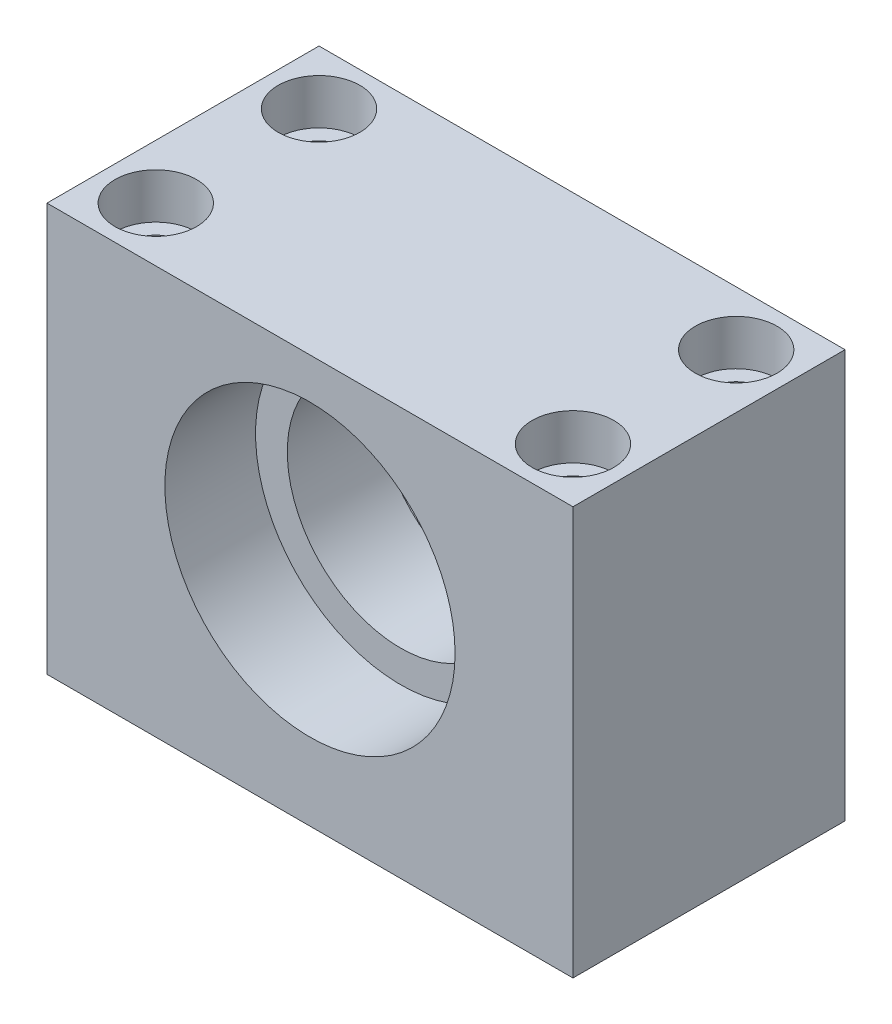
ISO-10303-21;
HEADER;
FILE_DESCRIPTION(('STEP AP214'),'2;1');
FILE_NAME('part.step','',(''),(''),'','','');
FILE_SCHEMA(('AUTOMOTIVE_DESIGN { 1 0 10303 214 1 1 1 1 }'));
ENDSEC;
DATA;
#1=APPLICATION_CONTEXT('core data for automotive mechanical design processes');
#2=APPLICATION_PROTOCOL_DEFINITION('international standard','automotive_design',2000,#1);
#3=PRODUCT_CONTEXT('',#1,'mechanical');
#4=PRODUCT('Part','Part','',(#3));
#5=PRODUCT_RELATED_PRODUCT_CATEGORY('part','',(#4));
#6=PRODUCT_DEFINITION_FORMATION('','',#4);
#7=PRODUCT_DEFINITION_CONTEXT('part definition',#1,'design');
#8=PRODUCT_DEFINITION('design','',#6,#7);
#9=PRODUCT_DEFINITION_SHAPE('','',#8);
#10=(LENGTH_UNIT() NAMED_UNIT(*) SI_UNIT(.MILLI.,.METRE.));
#11=(NAMED_UNIT(*) PLANE_ANGLE_UNIT() SI_UNIT($,.RADIAN.));
#12=(NAMED_UNIT(*) SI_UNIT($,.STERADIAN.) SOLID_ANGLE_UNIT());
#13=UNCERTAINTY_MEASURE_WITH_UNIT(LENGTH_MEASURE(1.E-05),#10,'distance_accuracy_value','');
#14=(GEOMETRIC_REPRESENTATION_CONTEXT(3) GLOBAL_UNCERTAINTY_ASSIGNED_CONTEXT((#13)) GLOBAL_UNIT_ASSIGNED_CONTEXT((#10,
#11,#12)) REPRESENTATION_CONTEXT('',''));
#15=CARTESIAN_POINT('',(0.,0.,0.));
#16=DIRECTION('',(0.,0.,1.));
#17=DIRECTION('',(1.,0.,0.));
#18=AXIS2_PLACEMENT_3D('',#15,#16,#17);
#19=CARTESIAN_POINT('',(0.,24.5,-15.));
#20=DIRECTION('',(0.,0.,1.));
#21=DIRECTION('',(1.,0.,0.));
#22=AXIS2_PLACEMENT_3D('',#19,#20,#21);
#23=CYLINDRICAL_SURFACE('',#22,12.5);
#24=CARTESIAN_POINT('',(0.,24.5,5.));
#25=DIRECTION('',(0.,0.,1.));
#26=DIRECTION('',(1.,0.,0.));
#27=AXIS2_PLACEMENT_3D('',#24,#25,#26);
#28=CIRCLE('',#27,12.5);
#29=CARTESIAN_POINT('',(12.5,24.5,5.));
#30=VERTEX_POINT('',#29);
#31=EDGE_CURVE('E103',#30,#30,#28,.F.);
#32=ORIENTED_EDGE('',*,*,#31,.F.);
#33=EDGE_LOOP('',(#32));
#34=FACE_BOUND('',#33,.T.);
#35=CARTESIAN_POINT('',(0.,24.5,-5.));
#36=DIRECTION('',(0.,0.,-1.));
#37=DIRECTION('',(-1.,0.,0.));
#38=AXIS2_PLACEMENT_3D('',#35,#36,#37);
#39=CIRCLE('',#38,12.5);
#40=CARTESIAN_POINT('',(-12.5,24.5,-5.));
#41=VERTEX_POINT('',#40);
#42=EDGE_CURVE('E36',#41,#41,#39,.F.);
#43=ORIENTED_EDGE('',*,*,#42,.F.);
#44=EDGE_LOOP('',(#43));
#45=FACE_BOUND('',#44,.T.);
#46=ADVANCED_FACE('F32',(#34,#45),#23,.F.);
#47=CARTESIAN_POINT('',(-29.,45.,-15.));
#48=DIRECTION('',(0.,0.,1.));
#49=DIRECTION('',(1.,0.,0.));
#50=AXIS2_PLACEMENT_3D('',#47,#48,#49);
#51=PLANE('',#50);
#52=DIRECTION('',(-1.,0.,0.));
#53=VECTOR('',#52,1.);
#54=CARTESIAN_POINT('',(-29.,0.,-15.));
#55=LINE('',#54,#53);
#56=CARTESIAN_POINT('',(29.,0.,-15.));
#57=VERTEX_POINT('',#56);
#58=CARTESIAN_POINT('',(-29.,0.,-15.));
#59=VERTEX_POINT('',#58);
#60=EDGE_CURVE('E91',#57,#59,#55,.T.);
#61=ORIENTED_EDGE('',*,*,#60,.T.);
#62=DIRECTION('',(0.,-1.,0.));
#63=VECTOR('',#62,1.);
#64=CARTESIAN_POINT('',(-29.,45.,-15.));
#65=LINE('',#64,#63);
#66=CARTESIAN_POINT('',(-29.,45.,-15.));
#67=VERTEX_POINT('',#66);
#68=EDGE_CURVE('E42',#67,#59,#65,.T.);
#69=ORIENTED_EDGE('',*,*,#68,.F.);
#70=DIRECTION('',(-1.,0.,0.));
#71=VECTOR('',#70,1.);
#72=CARTESIAN_POINT('',(-29.,45.,-15.));
#73=LINE('',#72,#71);
#74=CARTESIAN_POINT('',(29.,45.,-15.));
#75=VERTEX_POINT('',#74);
#76=EDGE_CURVE('E81',#75,#67,#73,.T.);
#77=ORIENTED_EDGE('',*,*,#76,.F.);
#78=DIRECTION('',(0.,-1.,0.));
#79=VECTOR('',#78,1.);
#80=CARTESIAN_POINT('',(29.,45.,-15.));
#81=LINE('',#80,#79);
#82=EDGE_CURVE('E11',#75,#57,#81,.T.);
#83=ORIENTED_EDGE('',*,*,#82,.T.);
#84=EDGE_LOOP('',(#61,#69,#77,#83));
#85=FACE_BOUND('',#84,.T.);
#86=CARTESIAN_POINT('',(0.,24.5,-15.));
#87=DIRECTION('',(0.,0.,1.));
#88=DIRECTION('',(1.,0.,0.));
#89=AXIS2_PLACEMENT_3D('',#86,#87,#88);
#90=CIRCLE('',#89,16.);
#91=CARTESIAN_POINT('',(16.,24.5,-15.));
#92=VERTEX_POINT('',#91);
#93=EDGE_CURVE('E120',#92,#92,#90,.T.);
#94=ORIENTED_EDGE('',*,*,#93,.T.);
#95=EDGE_LOOP('',(#94));
#96=FACE_BOUND('',#95,.T.);
#97=ADVANCED_FACE('F89',(#85,#96),#51,.F.);
#98=CARTESIAN_POINT('',(29.,45.,15.));
#99=DIRECTION('',(-1.,0.,0.));
#100=DIRECTION('',(0.,0.,1.));
#101=AXIS2_PLACEMENT_3D('',#98,#99,#100);
#102=PLANE('',#101);
#103=DIRECTION('',(0.,0.,-1.));
#104=VECTOR('',#103,1.);
#105=CARTESIAN_POINT('',(29.,0.,15.));
#106=LINE('',#105,#104);
#107=CARTESIAN_POINT('',(29.,0.,15.));
#108=VERTEX_POINT('',#107);
#109=EDGE_CURVE('E100',#108,#57,#106,.T.);
#110=ORIENTED_EDGE('',*,*,#109,.T.);
#111=ORIENTED_EDGE('',*,*,#82,.F.);
#112=DIRECTION('',(0.,0.,-1.));
#113=VECTOR('',#112,1.);
#114=CARTESIAN_POINT('',(29.,45.,15.));
#115=LINE('',#114,#113);
#116=CARTESIAN_POINT('',(29.,45.,15.));
#117=VERTEX_POINT('',#116);
#118=EDGE_CURVE('E86',#117,#75,#115,.T.);
#119=ORIENTED_EDGE('',*,*,#118,.F.);
#120=DIRECTION('',(0.,-1.,0.));
#121=VECTOR('',#120,1.);
#122=CARTESIAN_POINT('',(29.,45.,15.));
#123=LINE('',#122,#121);
#124=EDGE_CURVE('E96',#117,#108,#123,.T.);
#125=ORIENTED_EDGE('',*,*,#124,.T.);
#126=EDGE_LOOP('',(#110,#111,#119,#125));
#127=FACE_BOUND('',#126,.T.);
#128=ADVANCED_FACE('F34',(#127),#102,.F.);
#129=CARTESIAN_POINT('',(-29.,45.,15.));
#130=DIRECTION('',(1.,0.,0.));
#131=DIRECTION('',(0.,0.,-1.));
#132=AXIS2_PLACEMENT_3D('',#129,#130,#131);
#133=PLANE('',#132);
#134=DIRECTION('',(0.,0.,1.));
#135=VECTOR('',#134,1.);
#136=CARTESIAN_POINT('',(-29.,0.,15.));
#137=LINE('',#136,#135);
#138=CARTESIAN_POINT('',(-29.,0.,15.));
#139=VERTEX_POINT('',#138);
#140=EDGE_CURVE('E68',#59,#139,#137,.T.);
#141=ORIENTED_EDGE('',*,*,#140,.T.);
#142=DIRECTION('',(0.,-1.,0.));
#143=VECTOR('',#142,1.);
#144=CARTESIAN_POINT('',(-29.,45.,15.));
#145=LINE('',#144,#143);
#146=CARTESIAN_POINT('',(-29.,45.,15.));
#147=VERTEX_POINT('',#146);
#148=EDGE_CURVE('E92',#147,#139,#145,.T.);
#149=ORIENTED_EDGE('',*,*,#148,.F.);
#150=DIRECTION('',(0.,0.,1.));
#151=VECTOR('',#150,1.);
#152=CARTESIAN_POINT('',(-29.,45.,15.));
#153=LINE('',#152,#151);
#154=EDGE_CURVE('E84',#67,#147,#153,.T.);
#155=ORIENTED_EDGE('',*,*,#154,.F.);
#156=ORIENTED_EDGE('',*,*,#68,.T.);
#157=EDGE_LOOP('',(#141,#149,#155,#156));
#158=FACE_BOUND('',#157,.T.);
#159=ADVANCED_FACE('F94',(#158),#133,.F.);
#160=CARTESIAN_POINT('',(-29.,45.,15.));
#161=DIRECTION('',(0.,0.,-1.));
#162=DIRECTION('',(-1.,0.,0.));
#163=AXIS2_PLACEMENT_3D('',#160,#161,#162);
#164=PLANE('',#163);
#165=CARTESIAN_POINT('',(0.,24.5,15.));
#166=DIRECTION('',(0.,0.,1.));
#167=DIRECTION('',(1.,0.,0.));
#168=AXIS2_PLACEMENT_3D('',#165,#166,#167);
#169=CIRCLE('',#168,16.);
#170=CARTESIAN_POINT('',(16.,24.5,15.));
#171=VERTEX_POINT('',#170);
#172=EDGE_CURVE('E113',#171,#171,#169,.T.);
#173=ORIENTED_EDGE('',*,*,#172,.F.);
#174=EDGE_LOOP('',(#173));
#175=FACE_BOUND('',#174,.T.);
#176=DIRECTION('',(1.,0.,0.));
#177=VECTOR('',#176,1.);
#178=CARTESIAN_POINT('',(-29.,0.,15.));
#179=LINE('',#178,#177);
#180=EDGE_CURVE('E74',#139,#108,#179,.T.);
#181=ORIENTED_EDGE('',*,*,#180,.T.);
#182=ORIENTED_EDGE('',*,*,#124,.F.);
#183=DIRECTION('',(1.,0.,0.));
#184=VECTOR('',#183,1.);
#185=CARTESIAN_POINT('',(-29.,45.,15.));
#186=LINE('',#185,#184);
#187=EDGE_CURVE('E51',#147,#117,#186,.T.);
#188=ORIENTED_EDGE('',*,*,#187,.F.);
#189=ORIENTED_EDGE('',*,*,#148,.T.);
#190=EDGE_LOOP('',(#181,#182,#188,#189));
#191=FACE_BOUND('',#190,.T.);
#192=ADVANCED_FACE('F180',(#175,#191),#164,.F.);
#193=CARTESIAN_POINT('',(0.,45.,0.));
#194=DIRECTION('',(0.,-1.,0.));
#195=DIRECTION('',(0.,0.,-1.));
#196=AXIS2_PLACEMENT_3D('',#193,#194,#195);
#197=PLANE('',#196);
#198=CARTESIAN_POINT('',(-23.,45.,9.));
#199=DIRECTION('',(0.,1.,0.));
#200=DIRECTION('',(0.,0.,1.));
#201=AXIS2_PLACEMENT_3D('',#198,#199,#200);
#202=CIRCLE('',#201,4.5);
#203=CARTESIAN_POINT('',(-23.,45.,13.5));
#204=VERTEX_POINT('',#203);
#205=EDGE_CURVE('E171',#204,#204,#202,.T.);
#206=ORIENTED_EDGE('',*,*,#205,.F.);
#207=EDGE_LOOP('',(#206));
#208=FACE_BOUND('',#207,.T.);
#209=CARTESIAN_POINT('',(-23.,45.,-9.));
#210=DIRECTION('',(0.,1.,0.));
#211=DIRECTION('',(0.,0.,1.));
#212=AXIS2_PLACEMENT_3D('',#209,#210,#211);
#213=CIRCLE('',#212,4.5);
#214=CARTESIAN_POINT('',(-23.,45.,-4.5));
#215=VERTEX_POINT('',#214);
#216=EDGE_CURVE('E159',#215,#215,#213,.T.);
#217=ORIENTED_EDGE('',*,*,#216,.F.);
#218=EDGE_LOOP('',(#217));
#219=FACE_BOUND('',#218,.T.);
#220=CARTESIAN_POINT('',(23.,45.,9.));
#221=DIRECTION('',(0.,1.,0.));
#222=DIRECTION('',(0.,0.,1.));
#223=AXIS2_PLACEMENT_3D('',#220,#221,#222);
#224=CIRCLE('',#223,4.5);
#225=CARTESIAN_POINT('',(23.,45.,13.5));
#226=VERTEX_POINT('',#225);
#227=EDGE_CURVE('E147',#226,#226,#224,.T.);
#228=ORIENTED_EDGE('',*,*,#227,.F.);
#229=EDGE_LOOP('',(#228));
#230=FACE_BOUND('',#229,.T.);
#231=CARTESIAN_POINT('',(23.,45.,-9.));
#232=DIRECTION('',(0.,1.,0.));
#233=DIRECTION('',(0.,0.,1.));
#234=AXIS2_PLACEMENT_3D('',#231,#232,#233);
#235=CIRCLE('',#234,4.5);
#236=CARTESIAN_POINT('',(23.,45.,-4.5));
#237=VERTEX_POINT('',#236);
#238=EDGE_CURVE('E135',#237,#237,#235,.T.);
#239=ORIENTED_EDGE('',*,*,#238,.F.);
#240=EDGE_LOOP('',(#239));
#241=FACE_BOUND('',#240,.T.);
#242=ORIENTED_EDGE('',*,*,#118,.T.);
#243=ORIENTED_EDGE('',*,*,#76,.T.);
#244=ORIENTED_EDGE('',*,*,#154,.T.);
#245=ORIENTED_EDGE('',*,*,#187,.T.);
#246=EDGE_LOOP('',(#242,#243,#244,#245));
#247=FACE_BOUND('',#246,.T.);
#248=ADVANCED_FACE('F82',(#208,#219,#230,#241,#247),#197,.F.);
#249=CARTESIAN_POINT('',(0.,0.,0.));
#250=DIRECTION('',(0.,-1.,0.));
#251=DIRECTION('',(0.,0.,-1.));
#252=AXIS2_PLACEMENT_3D('',#249,#250,#251);
#253=PLANE('',#252);
#254=CARTESIAN_POINT('',(-23.,0.,9.));
#255=DIRECTION('',(0.,1.,0.));
#256=DIRECTION('',(0.,0.,1.));
#257=AXIS2_PLACEMENT_3D('',#254,#255,#256);
#258=CIRCLE('',#257,2.74999999999999);
#259=CARTESIAN_POINT('',(-23.,0.,11.75));
#260=VERTEX_POINT('',#259);
#261=EDGE_CURVE('E162',#260,#260,#258,.T.);
#262=ORIENTED_EDGE('',*,*,#261,.T.);
#263=EDGE_LOOP('',(#262));
#264=FACE_BOUND('',#263,.T.);
#265=CARTESIAN_POINT('',(-23.,0.,-9.));
#266=DIRECTION('',(0.,1.,0.));
#267=DIRECTION('',(0.,0.,1.));
#268=AXIS2_PLACEMENT_3D('',#265,#266,#267);
#269=CIRCLE('',#268,2.74999999999999);
#270=CARTESIAN_POINT('',(-23.,0.,-6.25000000000001));
#271=VERTEX_POINT('',#270);
#272=EDGE_CURVE('E150',#271,#271,#269,.T.);
#273=ORIENTED_EDGE('',*,*,#272,.T.);
#274=EDGE_LOOP('',(#273));
#275=FACE_BOUND('',#274,.T.);
#276=CARTESIAN_POINT('',(23.,0.,9.));
#277=DIRECTION('',(0.,1.,0.));
#278=DIRECTION('',(0.,0.,1.));
#279=AXIS2_PLACEMENT_3D('',#276,#277,#278);
#280=CIRCLE('',#279,2.74999999999999);
#281=CARTESIAN_POINT('',(23.,0.,11.75));
#282=VERTEX_POINT('',#281);
#283=EDGE_CURVE('E138',#282,#282,#280,.T.);
#284=ORIENTED_EDGE('',*,*,#283,.T.);
#285=EDGE_LOOP('',(#284));
#286=FACE_BOUND('',#285,.T.);
#287=CARTESIAN_POINT('',(23.,0.,-9.));
#288=DIRECTION('',(0.,1.,0.));
#289=DIRECTION('',(0.,0.,1.));
#290=AXIS2_PLACEMENT_3D('',#287,#288,#289);
#291=CIRCLE('',#290,2.74999999999999);
#292=CARTESIAN_POINT('',(23.,0.,-6.25000000000001));
#293=VERTEX_POINT('',#292);
#294=EDGE_CURVE('E124',#293,#293,#291,.T.);
#295=ORIENTED_EDGE('',*,*,#294,.T.);
#296=EDGE_LOOP('',(#295));
#297=FACE_BOUND('',#296,.T.);
#298=ORIENTED_EDGE('',*,*,#109,.F.);
#299=ORIENTED_EDGE('',*,*,#180,.F.);
#300=ORIENTED_EDGE('',*,*,#140,.F.);
#301=ORIENTED_EDGE('',*,*,#60,.F.);
#302=EDGE_LOOP('',(#298,#299,#300,#301));
#303=FACE_BOUND('',#302,.T.);
#304=ADVANCED_FACE('F179',(#264,#275,#286,#297,#303),#253,.T.);
#305=CARTESIAN_POINT('',(0.,24.5,5.));
#306=DIRECTION('',(0.,0.,1.));
#307=DIRECTION('',(1.,0.,0.));
#308=AXIS2_PLACEMENT_3D('',#305,#306,#307);
#309=PLANE('',#308);
#310=CARTESIAN_POINT('',(0.,24.5,5.));
#311=DIRECTION('',(0.,0.,1.));
#312=DIRECTION('',(1.,0.,0.));
#313=AXIS2_PLACEMENT_3D('',#310,#311,#312);
#314=CIRCLE('',#313,16.);
#315=CARTESIAN_POINT('',(16.,24.5,5.));
#316=VERTEX_POINT('',#315);
#317=EDGE_CURVE('E109',#316,#316,#314,.T.);
#318=ORIENTED_EDGE('',*,*,#317,.T.);
#319=EDGE_LOOP('',(#318));
#320=FACE_BOUND('',#319,.T.);
#321=ORIENTED_EDGE('',*,*,#31,.T.);
#322=EDGE_LOOP('',(#321));
#323=FACE_BOUND('',#322,.T.);
#324=ADVANCED_FACE('F218',(#320,#323),#309,.T.);
#325=CARTESIAN_POINT('',(0.,24.5,5.));
#326=DIRECTION('',(0.,0.,1.));
#327=DIRECTION('',(1.,0.,0.));
#328=AXIS2_PLACEMENT_3D('',#325,#326,#327);
#329=CYLINDRICAL_SURFACE('',#328,16.);
#330=ORIENTED_EDGE('',*,*,#317,.F.);
#331=EDGE_LOOP('',(#330));
#332=FACE_BOUND('',#331,.T.);
#333=ORIENTED_EDGE('',*,*,#172,.T.);
#334=EDGE_LOOP('',(#333));
#335=FACE_BOUND('',#334,.T.);
#336=ADVANCED_FACE('F213',(#332,#335),#329,.F.);
#337=CARTESIAN_POINT('',(0.,24.5,-5.));
#338=DIRECTION('',(0.,0.,-1.));
#339=DIRECTION('',(1.,0.,0.));
#340=AXIS2_PLACEMENT_3D('',#337,#338,#339);
#341=PLANE('',#340);
#342=CARTESIAN_POINT('',(0.,24.5,-5.));
#343=DIRECTION('',(0.,0.,1.));
#344=DIRECTION('',(1.,0.,0.));
#345=AXIS2_PLACEMENT_3D('',#342,#343,#344);
#346=CIRCLE('',#345,16.);
#347=CARTESIAN_POINT('',(16.,24.5,-5.));
#348=VERTEX_POINT('',#347);
#349=EDGE_CURVE('E123',#348,#348,#346,.T.);
#350=ORIENTED_EDGE('',*,*,#349,.F.);
#351=EDGE_LOOP('',(#350));
#352=FACE_BOUND('',#351,.T.);
#353=ORIENTED_EDGE('',*,*,#42,.T.);
#354=EDGE_LOOP('',(#353));
#355=FACE_BOUND('',#354,.T.);
#356=ADVANCED_FACE('F245',(#352,#355),#341,.T.);
#357=CARTESIAN_POINT('',(0.,24.5,-5.));
#358=DIRECTION('',(0.,0.,-1.));
#359=DIRECTION('',(-1.,0.,0.));
#360=AXIS2_PLACEMENT_3D('',#357,#358,#359);
#361=CYLINDRICAL_SURFACE('',#360,16.);
#362=ORIENTED_EDGE('',*,*,#349,.T.);
#363=EDGE_LOOP('',(#362));
#364=FACE_BOUND('',#363,.T.);
#365=ORIENTED_EDGE('',*,*,#93,.F.);
#366=EDGE_LOOP('',(#365));
#367=FACE_BOUND('',#366,.T.);
#368=ADVANCED_FACE('F250',(#364,#367),#361,.F.);
#369=CARTESIAN_POINT('',(23.,45.,-9.));
#370=DIRECTION('',(0.,1.,0.));
#371=DIRECTION('',(0.,0.,1.));
#372=AXIS2_PLACEMENT_3D('',#369,#370,#371);
#373=CYLINDRICAL_SURFACE('',#372,2.75);
#374=ORIENTED_EDGE('',*,*,#294,.F.);
#375=EDGE_LOOP('',(#374));
#376=FACE_BOUND('',#375,.T.);
#377=CARTESIAN_POINT('',(23.,40.,-9.));
#378=DIRECTION('',(0.,1.,0.));
#379=DIRECTION('',(0.,0.,1.));
#380=AXIS2_PLACEMENT_3D('',#377,#378,#379);
#381=CIRCLE('',#380,2.75);
#382=CARTESIAN_POINT('',(23.,40.,-6.25));
#383=VERTEX_POINT('',#382);
#384=EDGE_CURVE('E129',#383,#383,#381,.T.);
#385=ORIENTED_EDGE('',*,*,#384,.T.);
#386=EDGE_LOOP('',(#385));
#387=FACE_BOUND('',#386,.T.);
#388=ADVANCED_FACE('F201',(#376,#387),#373,.F.);
#389=CARTESIAN_POINT('',(25.75,40.,-9.));
#390=DIRECTION('',(0.,-1.,0.));
#391=DIRECTION('',(0.,0.,-1.));
#392=AXIS2_PLACEMENT_3D('',#389,#390,#391);
#393=PLANE('',#392);
#394=ORIENTED_EDGE('',*,*,#384,.F.);
#395=EDGE_LOOP('',(#394));
#396=FACE_BOUND('',#395,.T.);
#397=CARTESIAN_POINT('',(23.,40.,-9.));
#398=DIRECTION('',(0.,1.,0.));
#399=DIRECTION('',(0.,0.,1.));
#400=AXIS2_PLACEMENT_3D('',#397,#398,#399);
#401=CIRCLE('',#400,4.5);
#402=CARTESIAN_POINT('',(23.,40.,-4.5));
#403=VERTEX_POINT('',#402);
#404=EDGE_CURVE('E132',#403,#403,#401,.T.);
#405=ORIENTED_EDGE('',*,*,#404,.T.);
#406=EDGE_LOOP('',(#405));
#407=FACE_BOUND('',#406,.T.);
#408=ADVANCED_FACE('F191',(#396,#407),#393,.F.);
#409=CARTESIAN_POINT('',(23.,45.,-9.));
#410=DIRECTION('',(0.,1.,0.));
#411=DIRECTION('',(0.,0.,1.));
#412=AXIS2_PLACEMENT_3D('',#409,#410,#411);
#413=CYLINDRICAL_SURFACE('',#412,4.5);
#414=ORIENTED_EDGE('',*,*,#404,.F.);
#415=EDGE_LOOP('',(#414));
#416=FACE_BOUND('',#415,.T.);
#417=ORIENTED_EDGE('',*,*,#238,.T.);
#418=EDGE_LOOP('',(#417));
#419=FACE_BOUND('',#418,.T.);
#420=ADVANCED_FACE('F188',(#416,#419),#413,.F.);
#421=CARTESIAN_POINT('',(23.,45.,9.));
#422=DIRECTION('',(0.,1.,0.));
#423=DIRECTION('',(0.,0.,1.));
#424=AXIS2_PLACEMENT_3D('',#421,#422,#423);
#425=CYLINDRICAL_SURFACE('',#424,2.75);
#426=ORIENTED_EDGE('',*,*,#283,.F.);
#427=EDGE_LOOP('',(#426));
#428=FACE_BOUND('',#427,.T.);
#429=CARTESIAN_POINT('',(23.,40.,9.));
#430=DIRECTION('',(0.,1.,0.));
#431=DIRECTION('',(0.,0.,1.));
#432=AXIS2_PLACEMENT_3D('',#429,#430,#431);
#433=CIRCLE('',#432,2.75);
#434=CARTESIAN_POINT('',(23.,40.,11.75));
#435=VERTEX_POINT('',#434);
#436=EDGE_CURVE('E141',#435,#435,#433,.T.);
#437=ORIENTED_EDGE('',*,*,#436,.T.);
#438=EDGE_LOOP('',(#437));
#439=FACE_BOUND('',#438,.T.);
#440=ADVANCED_FACE('F190',(#428,#439),#425,.F.);
#441=CARTESIAN_POINT('',(25.75,40.,9.));
#442=DIRECTION('',(0.,-1.,0.));
#443=DIRECTION('',(0.,0.,-1.));
#444=AXIS2_PLACEMENT_3D('',#441,#442,#443);
#445=PLANE('',#444);
#446=ORIENTED_EDGE('',*,*,#436,.F.);
#447=EDGE_LOOP('',(#446));
#448=FACE_BOUND('',#447,.T.);
#449=CARTESIAN_POINT('',(23.,40.,9.));
#450=DIRECTION('',(0.,1.,0.));
#451=DIRECTION('',(0.,0.,1.));
#452=AXIS2_PLACEMENT_3D('',#449,#450,#451);
#453=CIRCLE('',#452,4.5);
#454=CARTESIAN_POINT('',(23.,40.,13.5));
#455=VERTEX_POINT('',#454);
#456=EDGE_CURVE('E144',#455,#455,#453,.T.);
#457=ORIENTED_EDGE('',*,*,#456,.T.);
#458=EDGE_LOOP('',(#457));
#459=FACE_BOUND('',#458,.T.);
#460=ADVANCED_FACE('F198',(#448,#459),#445,.F.);
#461=CARTESIAN_POINT('',(23.,45.,9.));
#462=DIRECTION('',(0.,1.,0.));
#463=DIRECTION('',(0.,0.,1.));
#464=AXIS2_PLACEMENT_3D('',#461,#462,#463);
#465=CYLINDRICAL_SURFACE('',#464,4.5);
#466=ORIENTED_EDGE('',*,*,#456,.F.);
#467=EDGE_LOOP('',(#466));
#468=FACE_BOUND('',#467,.T.);
#469=ORIENTED_EDGE('',*,*,#227,.T.);
#470=EDGE_LOOP('',(#469));
#471=FACE_BOUND('',#470,.T.);
#472=ADVANCED_FACE('F310',(#468,#471),#465,.F.);
#473=CARTESIAN_POINT('',(-23.,45.,-9.));
#474=DIRECTION('',(0.,1.,0.));
#475=DIRECTION('',(0.,0.,1.));
#476=AXIS2_PLACEMENT_3D('',#473,#474,#475);
#477=CYLINDRICAL_SURFACE('',#476,2.75);
#478=ORIENTED_EDGE('',*,*,#272,.F.);
#479=EDGE_LOOP('',(#478));
#480=FACE_BOUND('',#479,.T.);
#481=CARTESIAN_POINT('',(-23.,40.,-9.));
#482=DIRECTION('',(0.,1.,0.));
#483=DIRECTION('',(0.,0.,1.));
#484=AXIS2_PLACEMENT_3D('',#481,#482,#483);
#485=CIRCLE('',#484,2.75);
#486=CARTESIAN_POINT('',(-23.,40.,-6.25));
#487=VERTEX_POINT('',#486);
#488=EDGE_CURVE('E153',#487,#487,#485,.T.);
#489=ORIENTED_EDGE('',*,*,#488,.T.);
#490=EDGE_LOOP('',(#489));
#491=FACE_BOUND('',#490,.T.);
#492=ADVANCED_FACE('F320',(#480,#491),#477,.F.);
#493=CARTESIAN_POINT('',(-20.25,40.,-9.));
#494=DIRECTION('',(0.,-1.,0.));
#495=DIRECTION('',(0.,0.,-1.));
#496=AXIS2_PLACEMENT_3D('',#493,#494,#495);
#497=PLANE('',#496);
#498=ORIENTED_EDGE('',*,*,#488,.F.);
#499=EDGE_LOOP('',(#498));
#500=FACE_BOUND('',#499,.T.);
#501=CARTESIAN_POINT('',(-23.,40.,-9.));
#502=DIRECTION('',(0.,1.,0.));
#503=DIRECTION('',(0.,0.,1.));
#504=AXIS2_PLACEMENT_3D('',#501,#502,#503);
#505=CIRCLE('',#504,4.5);
#506=CARTESIAN_POINT('',(-23.,40.,-4.5));
#507=VERTEX_POINT('',#506);
#508=EDGE_CURVE('E156',#507,#507,#505,.T.);
#509=ORIENTED_EDGE('',*,*,#508,.T.);
#510=EDGE_LOOP('',(#509));
#511=FACE_BOUND('',#510,.T.);
#512=ADVANCED_FACE('F330',(#500,#511),#497,.F.);
#513=CARTESIAN_POINT('',(-23.,45.,-9.));
#514=DIRECTION('',(0.,1.,0.));
#515=DIRECTION('',(0.,0.,1.));
#516=AXIS2_PLACEMENT_3D('',#513,#514,#515);
#517=CYLINDRICAL_SURFACE('',#516,4.5);
#518=ORIENTED_EDGE('',*,*,#508,.F.);
#519=EDGE_LOOP('',(#518));
#520=FACE_BOUND('',#519,.T.);
#521=ORIENTED_EDGE('',*,*,#216,.T.);
#522=EDGE_LOOP('',(#521));
#523=FACE_BOUND('',#522,.T.);
#524=ADVANCED_FACE('F340',(#520,#523),#517,.F.);
#525=CARTESIAN_POINT('',(-23.,45.,9.));
#526=DIRECTION('',(0.,1.,0.));
#527=DIRECTION('',(0.,0.,1.));
#528=AXIS2_PLACEMENT_3D('',#525,#526,#527);
#529=CYLINDRICAL_SURFACE('',#528,2.75);
#530=ORIENTED_EDGE('',*,*,#261,.F.);
#531=EDGE_LOOP('',(#530));
#532=FACE_BOUND('',#531,.T.);
#533=CARTESIAN_POINT('',(-23.,40.,9.));
#534=DIRECTION('',(0.,1.,0.));
#535=DIRECTION('',(0.,0.,1.));
#536=AXIS2_PLACEMENT_3D('',#533,#534,#535);
#537=CIRCLE('',#536,2.75);
#538=CARTESIAN_POINT('',(-23.,40.,11.75));
#539=VERTEX_POINT('',#538);
#540=EDGE_CURVE('E165',#539,#539,#537,.T.);
#541=ORIENTED_EDGE('',*,*,#540,.T.);
#542=EDGE_LOOP('',(#541));
#543=FACE_BOUND('',#542,.T.);
#544=ADVANCED_FACE('F350',(#532,#543),#529,.F.);
#545=CARTESIAN_POINT('',(-20.25,40.,9.));
#546=DIRECTION('',(0.,-1.,0.));
#547=DIRECTION('',(0.,0.,-1.));
#548=AXIS2_PLACEMENT_3D('',#545,#546,#547);
#549=PLANE('',#548);
#550=ORIENTED_EDGE('',*,*,#540,.F.);
#551=EDGE_LOOP('',(#550));
#552=FACE_BOUND('',#551,.T.);
#553=CARTESIAN_POINT('',(-23.,40.,9.));
#554=DIRECTION('',(0.,1.,0.));
#555=DIRECTION('',(0.,0.,1.));
#556=AXIS2_PLACEMENT_3D('',#553,#554,#555);
#557=CIRCLE('',#556,4.5);
#558=CARTESIAN_POINT('',(-23.,40.,13.5));
#559=VERTEX_POINT('',#558);
#560=EDGE_CURVE('E168',#559,#559,#557,.T.);
#561=ORIENTED_EDGE('',*,*,#560,.T.);
#562=EDGE_LOOP('',(#561));
#563=FACE_BOUND('',#562,.T.);
#564=ADVANCED_FACE('F360',(#552,#563),#549,.F.);
#565=CARTESIAN_POINT('',(-23.,45.,9.));
#566=DIRECTION('',(0.,1.,0.));
#567=DIRECTION('',(0.,0.,1.));
#568=AXIS2_PLACEMENT_3D('',#565,#566,#567);
#569=CYLINDRICAL_SURFACE('',#568,4.5);
#570=ORIENTED_EDGE('',*,*,#560,.F.);
#571=EDGE_LOOP('',(#570));
#572=FACE_BOUND('',#571,.T.);
#573=ORIENTED_EDGE('',*,*,#205,.T.);
#574=EDGE_LOOP('',(#573));
#575=FACE_BOUND('',#574,.T.);
#576=ADVANCED_FACE('F175',(#572,#575),#569,.F.);
#577=CLOSED_SHELL('',(#46,#97,#128,#159,#192,#248,#304,#324,#336,#356,#368,#388,#408,#420,#440,
#460,#472,#492,#512,#524,#544,#564,#576));
#578=MANIFOLD_SOLID_BREP('B2',#577);
#579=ADVANCED_BREP_SHAPE_REPRESENTATION('',(#18,#578),#14);
#580=SHAPE_DEFINITION_REPRESENTATION(#9,#579);
ENDSEC;
END-ISO-10303-21;
